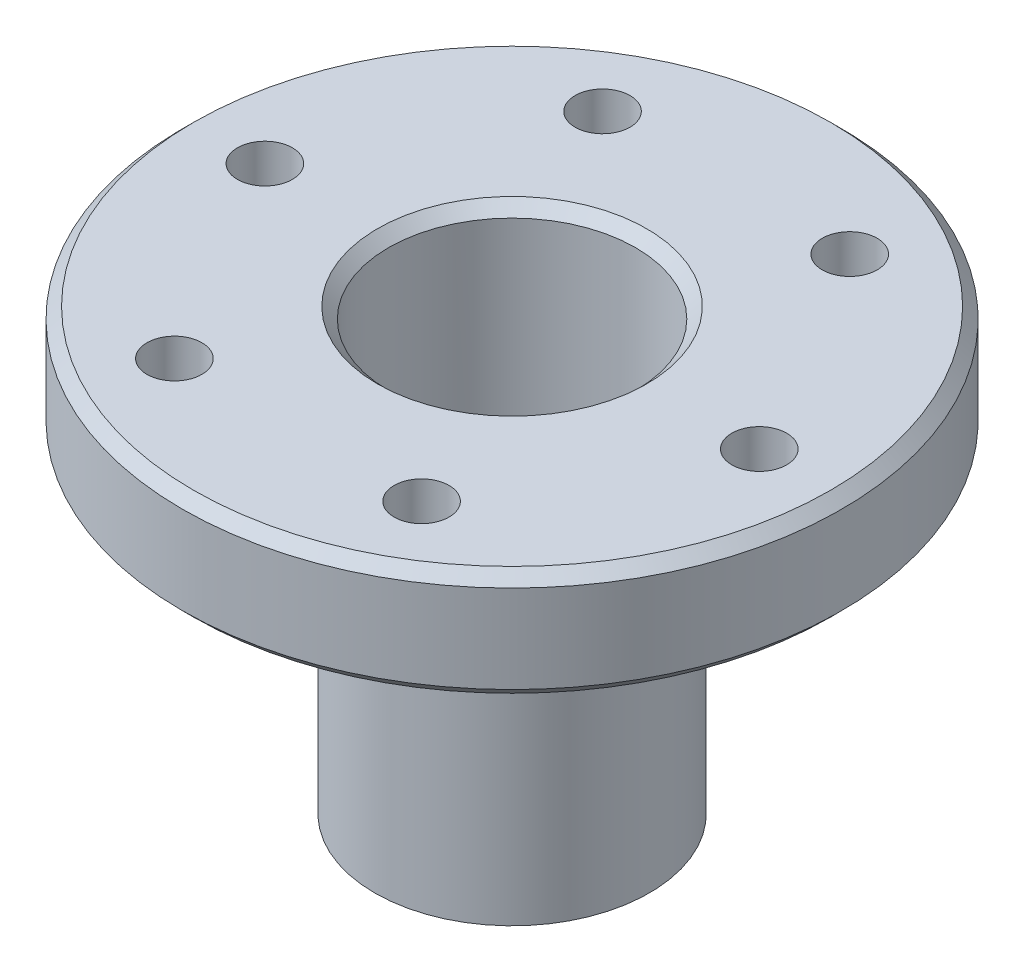
ISO-10303-21;
HEADER;
FILE_DESCRIPTION(('STEP AP214'),'2;1');
FILE_NAME('part.step','',(''),(''),'','','');
FILE_SCHEMA(('AUTOMOTIVE_DESIGN { 1 0 10303 214 1 1 1 1 }'));
ENDSEC;
DATA;
#1=APPLICATION_CONTEXT('core data for automotive mechanical design processes');
#2=APPLICATION_PROTOCOL_DEFINITION('international standard','automotive_design',2000,#1);
#3=PRODUCT_CONTEXT('',#1,'mechanical');
#4=PRODUCT('Part','Part','',(#3));
#5=PRODUCT_RELATED_PRODUCT_CATEGORY('part','',(#4));
#6=PRODUCT_DEFINITION_FORMATION('','',#4);
#7=PRODUCT_DEFINITION_CONTEXT('part definition',#1,'design');
#8=PRODUCT_DEFINITION('design','',#6,#7);
#9=PRODUCT_DEFINITION_SHAPE('','',#8);
#10=(LENGTH_UNIT() NAMED_UNIT(*) SI_UNIT(.MILLI.,.METRE.));
#11=(NAMED_UNIT(*) PLANE_ANGLE_UNIT() SI_UNIT($,.RADIAN.));
#12=(NAMED_UNIT(*) SI_UNIT($,.STERADIAN.) SOLID_ANGLE_UNIT());
#13=UNCERTAINTY_MEASURE_WITH_UNIT(LENGTH_MEASURE(1.E-05),#10,'distance_accuracy_value','');
#14=(GEOMETRIC_REPRESENTATION_CONTEXT(3) GLOBAL_UNCERTAINTY_ASSIGNED_CONTEXT((#13)) GLOBAL_UNIT_ASSIGNED_CONTEXT((#10,
#11,#12)) REPRESENTATION_CONTEXT('',''));
#15=CARTESIAN_POINT('',(0.,0.,0.));
#16=DIRECTION('',(0.,0.,1.));
#17=DIRECTION('',(1.,0.,0.));
#18=AXIS2_PLACEMENT_3D('',#15,#16,#17);
#19=CARTESIAN_POINT('',(0.,0.,0.));
#20=DIRECTION('',(0.,1.,0.));
#21=DIRECTION('',(0.,0.,1.));
#22=AXIS2_PLACEMENT_3D('',#19,#20,#21);
#23=PLANE('',#22);
#24=CARTESIAN_POINT('',(22.5000000000005,0.,-38.9711431702995));
#25=DIRECTION('',(0.,1.,0.));
#26=DIRECTION('',(0.,0.,1.));
#27=AXIS2_PLACEMENT_3D('',#24,#25,#26);
#28=CIRCLE('',#27,5.);
#29=CARTESIAN_POINT('',(22.5000000000005,0.,-33.9711431702995));
#30=VERTEX_POINT('',#29);
#31=EDGE_CURVE('E104',#30,#30,#28,.T.);
#32=ORIENTED_EDGE('',*,*,#31,.T.);
#33=EDGE_LOOP('',(#32));
#34=FACE_BOUND('',#33,.T.);
#35=CARTESIAN_POINT('',(-22.4999999999996,0.,-38.9711431702999));
#36=DIRECTION('',(0.,1.,0.));
#37=DIRECTION('',(0.,0.,1.));
#38=AXIS2_PLACEMENT_3D('',#35,#36,#37);
#39=CIRCLE('',#38,4.99999999999999);
#40=CARTESIAN_POINT('',(-22.4999999999996,0.,-33.9711431703));
#41=VERTEX_POINT('',#40);
#42=EDGE_CURVE('E98',#41,#41,#39,.T.);
#43=ORIENTED_EDGE('',*,*,#42,.T.);
#44=EDGE_LOOP('',(#43));
#45=FACE_BOUND('',#44,.T.);
#46=CARTESIAN_POINT('',(-45.,0.,-3.14233320495882E-13));
#47=DIRECTION('',(0.,1.,0.));
#48=DIRECTION('',(0.,0.,1.));
#49=AXIS2_PLACEMENT_3D('',#46,#47,#48);
#50=CIRCLE('',#49,4.99999999999999);
#51=CARTESIAN_POINT('',(-45.,0.,4.99999999999968));
#52=VERTEX_POINT('',#51);
#53=EDGE_CURVE('E92',#52,#52,#50,.T.);
#54=ORIENTED_EDGE('',*,*,#53,.T.);
#55=EDGE_LOOP('',(#54));
#56=FACE_BOUND('',#55,.T.);
#57=CARTESIAN_POINT('',(-22.5000000000002,0.,38.9711431702996));
#58=DIRECTION('',(0.,1.,0.));
#59=DIRECTION('',(0.,0.,1.));
#60=AXIS2_PLACEMENT_3D('',#57,#58,#59);
#61=CIRCLE('',#60,5.);
#62=CARTESIAN_POINT('',(-22.5000000000002,0.,43.9711431702996));
#63=VERTEX_POINT('',#62);
#64=EDGE_CURVE('E86',#63,#63,#61,.T.);
#65=ORIENTED_EDGE('',*,*,#64,.T.);
#66=EDGE_LOOP('',(#65));
#67=FACE_BOUND('',#66,.T.);
#68=CARTESIAN_POINT('',(22.4999999999999,0.,38.9711431702998));
#69=DIRECTION('',(0.,1.,0.));
#70=DIRECTION('',(0.,0.,1.));
#71=AXIS2_PLACEMENT_3D('',#68,#69,#70);
#72=CIRCLE('',#71,5.);
#73=CARTESIAN_POINT('',(22.4999999999999,0.,43.9711431702998));
#74=VERTEX_POINT('',#73);
#75=EDGE_CURVE('E80',#74,#74,#72,.T.);
#76=ORIENTED_EDGE('',*,*,#75,.T.);
#77=EDGE_LOOP('',(#76));
#78=FACE_BOUND('',#77,.T.);
#79=CARTESIAN_POINT('',(45.,0.,0.));
#80=DIRECTION('',(0.,1.,0.));
#81=DIRECTION('',(0.,0.,1.));
#82=AXIS2_PLACEMENT_3D('',#79,#80,#81);
#83=CIRCLE('',#82,5.);
#84=CARTESIAN_POINT('',(45.,0.,5.));
#85=VERTEX_POINT('',#84);
#86=EDGE_CURVE('E74',#85,#85,#83,.T.);
#87=ORIENTED_EDGE('',*,*,#86,.T.);
#88=EDGE_LOOP('',(#87));
#89=FACE_BOUND('',#88,.T.);
#90=CARTESIAN_POINT('',(0.,0.,0.));
#91=DIRECTION('',(0.,1.,0.));
#92=DIRECTION('',(0.,0.,1.));
#93=AXIS2_PLACEMENT_3D('',#90,#91,#92);
#94=CIRCLE('',#93,58.);
#95=CARTESIAN_POINT('',(0.,0.,58.));
#96=VERTEX_POINT('',#95);
#97=EDGE_CURVE('E64',#96,#96,#94,.F.);
#98=ORIENTED_EDGE('',*,*,#97,.T.);
#99=EDGE_LOOP('',(#98));
#100=FACE_BOUND('',#99,.T.);
#101=CARTESIAN_POINT('',(0.,0.,0.));
#102=DIRECTION('',(0.,1.,0.));
#103=DIRECTION('',(0.,0.,1.));
#104=AXIS2_PLACEMENT_3D('',#101,#102,#103);
#105=CIRCLE('',#104,25.);
#106=CARTESIAN_POINT('',(0.,0.,25.));
#107=VERTEX_POINT('',#106);
#108=EDGE_CURVE('E49',#107,#107,#105,.F.);
#109=ORIENTED_EDGE('',*,*,#108,.F.);
#110=EDGE_LOOP('',(#109));
#111=FACE_BOUND('',#110,.T.);
#112=ADVANCED_FACE('F37',(#34,#45,#56,#67,#78,#89,#100,#111),#23,.F.);
#113=CARTESIAN_POINT('',(0.,20.,0.));
#114=DIRECTION('',(0.,1.,0.));
#115=DIRECTION('',(0.,0.,1.));
#116=AXIS2_PLACEMENT_3D('',#113,#114,#115);
#117=PLANE('',#116);
#118=CARTESIAN_POINT('',(0.,20.,0.));
#119=DIRECTION('',(0.,1.,0.));
#120=DIRECTION('',(0.,0.,1.));
#121=AXIS2_PLACEMENT_3D('',#118,#119,#120);
#122=CIRCLE('',#121,24.5);
#123=CARTESIAN_POINT('',(0.,20.,24.5));
#124=VERTEX_POINT('',#123);
#125=EDGE_CURVE('E53',#124,#124,#122,.F.);
#126=ORIENTED_EDGE('',*,*,#125,.T.);
#127=EDGE_LOOP('',(#126));
#128=FACE_BOUND('',#127,.T.);
#129=CARTESIAN_POINT('',(0.,20.,0.));
#130=DIRECTION('',(0.,1.,0.));
#131=DIRECTION('',(0.,0.,1.));
#132=AXIS2_PLACEMENT_3D('',#129,#130,#131);
#133=CIRCLE('',#132,58.);
#134=CARTESIAN_POINT('',(0.,20.,58.));
#135=VERTEX_POINT('',#134);
#136=EDGE_CURVE('E58',#135,#135,#133,.T.);
#137=ORIENTED_EDGE('',*,*,#136,.T.);
#138=EDGE_LOOP('',(#137));
#139=FACE_BOUND('',#138,.T.);
#140=CARTESIAN_POINT('',(-22.4999999999996,20.,-38.9711431702999));
#141=DIRECTION('',(0.,1.,0.));
#142=DIRECTION('',(0.,0.,1.));
#143=AXIS2_PLACEMENT_3D('',#140,#141,#142);
#144=CIRCLE('',#143,4.99999999999999);
#145=CARTESIAN_POINT('',(-22.4999999999996,20.,-33.9711431703));
#146=VERTEX_POINT('',#145);
#147=EDGE_CURVE('E95',#146,#146,#144,.T.);
#148=ORIENTED_EDGE('',*,*,#147,.F.);
#149=EDGE_LOOP('',(#148));
#150=FACE_BOUND('',#149,.T.);
#151=CARTESIAN_POINT('',(-22.5000000000002,20.,38.9711431702996));
#152=DIRECTION('',(0.,1.,0.));
#153=DIRECTION('',(0.,0.,1.));
#154=AXIS2_PLACEMENT_3D('',#151,#152,#153);
#155=CIRCLE('',#154,5.);
#156=CARTESIAN_POINT('',(-22.5000000000002,20.,43.9711431702996));
#157=VERTEX_POINT('',#156);
#158=EDGE_CURVE('E83',#157,#157,#155,.T.);
#159=ORIENTED_EDGE('',*,*,#158,.F.);
#160=EDGE_LOOP('',(#159));
#161=FACE_BOUND('',#160,.T.);
#162=CARTESIAN_POINT('',(45.,20.,0.));
#163=DIRECTION('',(0.,1.,0.));
#164=DIRECTION('',(0.,0.,1.));
#165=AXIS2_PLACEMENT_3D('',#162,#163,#164);
#166=CIRCLE('',#165,5.);
#167=CARTESIAN_POINT('',(45.,20.,5.));
#168=VERTEX_POINT('',#167);
#169=EDGE_CURVE('E73',#168,#168,#166,.T.);
#170=ORIENTED_EDGE('',*,*,#169,.F.);
#171=EDGE_LOOP('',(#170));
#172=FACE_BOUND('',#171,.T.);
#173=CARTESIAN_POINT('',(22.4999999999999,20.,38.9711431702998));
#174=DIRECTION('',(0.,1.,0.));
#175=DIRECTION('',(0.,0.,1.));
#176=AXIS2_PLACEMENT_3D('',#173,#174,#175);
#177=CIRCLE('',#176,5.);
#178=CARTESIAN_POINT('',(22.4999999999999,20.,43.9711431702998));
#179=VERTEX_POINT('',#178);
#180=EDGE_CURVE('E77',#179,#179,#177,.T.);
#181=ORIENTED_EDGE('',*,*,#180,.F.);
#182=EDGE_LOOP('',(#181));
#183=FACE_BOUND('',#182,.T.);
#184=CARTESIAN_POINT('',(-45.,20.,-3.14233320495882E-13));
#185=DIRECTION('',(0.,1.,0.));
#186=DIRECTION('',(0.,0.,1.));
#187=AXIS2_PLACEMENT_3D('',#184,#185,#186);
#188=CIRCLE('',#187,4.99999999999999);
#189=CARTESIAN_POINT('',(-45.,20.,4.99999999999968));
#190=VERTEX_POINT('',#189);
#191=EDGE_CURVE('E89',#190,#190,#188,.T.);
#192=ORIENTED_EDGE('',*,*,#191,.F.);
#193=EDGE_LOOP('',(#192));
#194=FACE_BOUND('',#193,.T.);
#195=CARTESIAN_POINT('',(22.5000000000005,20.,-38.9711431702995));
#196=DIRECTION('',(0.,1.,0.));
#197=DIRECTION('',(0.,0.,1.));
#198=AXIS2_PLACEMENT_3D('',#195,#196,#197);
#199=CIRCLE('',#198,5.);
#200=CARTESIAN_POINT('',(22.5000000000005,20.,-33.9711431702995));
#201=VERTEX_POINT('',#200);
#202=EDGE_CURVE('E101',#201,#201,#199,.T.);
#203=ORIENTED_EDGE('',*,*,#202,.F.);
#204=EDGE_LOOP('',(#203));
#205=FACE_BOUND('',#204,.T.);
#206=ADVANCED_FACE('F122',(#128,#139,#150,#161,#172,#183,#194,#205),#117,.T.);
#207=CARTESIAN_POINT('',(0.,20.,0.));
#208=DIRECTION('',(0.,-1.,0.));
#209=DIRECTION('',(0.,0.,-1.));
#210=AXIS2_PLACEMENT_3D('',#207,#208,#209);
#211=CYLINDRICAL_SURFACE('',#210,60.);
#212=CARTESIAN_POINT('',(0.,1.99999999999999,0.));
#213=DIRECTION('',(0.,1.,0.));
#214=DIRECTION('',(0.,0.,1.));
#215=AXIS2_PLACEMENT_3D('',#212,#213,#214);
#216=CIRCLE('',#215,60.);
#217=CARTESIAN_POINT('',(0.,1.99999999999999,60.));
#218=VERTEX_POINT('',#217);
#219=EDGE_CURVE('E67',#218,#218,#216,.T.);
#220=ORIENTED_EDGE('',*,*,#219,.T.);
#221=EDGE_LOOP('',(#220));
#222=FACE_BOUND('',#221,.T.);
#223=CARTESIAN_POINT('',(0.,18.,0.));
#224=DIRECTION('',(0.,1.,0.));
#225=DIRECTION('',(0.,0.,1.));
#226=AXIS2_PLACEMENT_3D('',#223,#224,#225);
#227=CIRCLE('',#226,60.);
#228=CARTESIAN_POINT('',(0.,18.,60.));
#229=VERTEX_POINT('',#228);
#230=EDGE_CURVE('E70',#229,#229,#227,.F.);
#231=ORIENTED_EDGE('',*,*,#230,.T.);
#232=EDGE_LOOP('',(#231));
#233=FACE_BOUND('',#232,.T.);
#234=ADVANCED_FACE('F128',(#222,#233),#211,.T.);
#235=CARTESIAN_POINT('',(0.,20.,0.));
#236=DIRECTION('',(0.,-1.,0.));
#237=DIRECTION('',(0.,0.,-1.));
#238=AXIS2_PLACEMENT_3D('',#235,#236,#237);
#239=CYLINDRICAL_SURFACE('',#238,22.5);
#240=CARTESIAN_POINT('',(0.,-58.,0.));
#241=DIRECTION('',(0.,-1.,0.));
#242=DIRECTION('',(0.,0.,-1.));
#243=AXIS2_PLACEMENT_3D('',#240,#241,#242);
#244=CIRCLE('',#243,22.5);
#245=CARTESIAN_POINT('',(0.,-58.,-22.5));
#246=VERTEX_POINT('',#245);
#247=EDGE_CURVE('E45',#246,#246,#244,.T.);
#248=ORIENTED_EDGE('',*,*,#247,.T.);
#249=EDGE_LOOP('',(#248));
#250=FACE_BOUND('',#249,.T.);
#251=CARTESIAN_POINT('',(0.,18.,0.));
#252=DIRECTION('',(0.,1.,0.));
#253=DIRECTION('',(0.,0.,1.));
#254=AXIS2_PLACEMENT_3D('',#251,#252,#253);
#255=CIRCLE('',#254,22.5);
#256=CARTESIAN_POINT('',(0.,18.,22.5));
#257=VERTEX_POINT('',#256);
#258=EDGE_CURVE('E61',#257,#257,#255,.T.);
#259=ORIENTED_EDGE('',*,*,#258,.T.);
#260=EDGE_LOOP('',(#259));
#261=FACE_BOUND('',#260,.T.);
#262=ADVANCED_FACE('F136',(#250,#261),#239,.F.);
#263=CARTESIAN_POINT('',(45.,20.,0.));
#264=DIRECTION('',(0.,-1.,0.));
#265=DIRECTION('',(0.,0.,-1.));
#266=AXIS2_PLACEMENT_3D('',#263,#264,#265);
#267=CYLINDRICAL_SURFACE('',#266,5.);
#268=ORIENTED_EDGE('',*,*,#169,.T.);
#269=EDGE_LOOP('',(#268));
#270=FACE_BOUND('',#269,.T.);
#271=ORIENTED_EDGE('',*,*,#86,.F.);
#272=EDGE_LOOP('',(#271));
#273=FACE_BOUND('',#272,.T.);
#274=ADVANCED_FACE('F201',(#270,#273),#267,.F.);
#275=CARTESIAN_POINT('',(22.4999999999999,20.,38.9711431702998));
#276=DIRECTION('',(0.,-1.,0.));
#277=DIRECTION('',(0.,0.,-1.));
#278=AXIS2_PLACEMENT_3D('',#275,#276,#277);
#279=CYLINDRICAL_SURFACE('',#278,5.);
#280=ORIENTED_EDGE('',*,*,#180,.T.);
#281=EDGE_LOOP('',(#280));
#282=FACE_BOUND('',#281,.T.);
#283=ORIENTED_EDGE('',*,*,#75,.F.);
#284=EDGE_LOOP('',(#283));
#285=FACE_BOUND('',#284,.T.);
#286=ADVANCED_FACE('F197',(#282,#285),#279,.F.);
#287=CARTESIAN_POINT('',(-22.5000000000002,20.,38.9711431702996));
#288=DIRECTION('',(0.,-1.,0.));
#289=DIRECTION('',(0.,0.,-1.));
#290=AXIS2_PLACEMENT_3D('',#287,#288,#289);
#291=CYLINDRICAL_SURFACE('',#290,5.);
#292=ORIENTED_EDGE('',*,*,#158,.T.);
#293=EDGE_LOOP('',(#292));
#294=FACE_BOUND('',#293,.T.);
#295=ORIENTED_EDGE('',*,*,#64,.F.);
#296=EDGE_LOOP('',(#295));
#297=FACE_BOUND('',#296,.T.);
#298=ADVANCED_FACE('F193',(#294,#297),#291,.F.);
#299=CARTESIAN_POINT('',(-45.,20.,-3.14233320495882E-13));
#300=DIRECTION('',(0.,-1.,0.));
#301=DIRECTION('',(0.,0.,-1.));
#302=AXIS2_PLACEMENT_3D('',#299,#300,#301);
#303=CYLINDRICAL_SURFACE('',#302,4.99999999999999);
#304=ORIENTED_EDGE('',*,*,#191,.T.);
#305=EDGE_LOOP('',(#304));
#306=FACE_BOUND('',#305,.T.);
#307=ORIENTED_EDGE('',*,*,#53,.F.);
#308=EDGE_LOOP('',(#307));
#309=FACE_BOUND('',#308,.T.);
#310=ADVANCED_FACE('F187',(#306,#309),#303,.F.);
#311=CARTESIAN_POINT('',(-22.4999999999996,20.,-38.9711431702999));
#312=DIRECTION('',(0.,-1.,0.));
#313=DIRECTION('',(0.,0.,-1.));
#314=AXIS2_PLACEMENT_3D('',#311,#312,#313);
#315=CYLINDRICAL_SURFACE('',#314,4.99999999999999);
#316=ORIENTED_EDGE('',*,*,#147,.T.);
#317=EDGE_LOOP('',(#316));
#318=FACE_BOUND('',#317,.T.);
#319=ORIENTED_EDGE('',*,*,#42,.F.);
#320=EDGE_LOOP('',(#319));
#321=FACE_BOUND('',#320,.T.);
#322=ADVANCED_FACE('F181',(#318,#321),#315,.F.);
#323=CARTESIAN_POINT('',(22.5000000000005,20.,-38.9711431702995));
#324=DIRECTION('',(0.,-1.,0.));
#325=DIRECTION('',(0.,0.,-1.));
#326=AXIS2_PLACEMENT_3D('',#323,#324,#325);
#327=CYLINDRICAL_SURFACE('',#326,5.);
#328=ORIENTED_EDGE('',*,*,#202,.T.);
#329=EDGE_LOOP('',(#328));
#330=FACE_BOUND('',#329,.T.);
#331=ORIENTED_EDGE('',*,*,#31,.F.);
#332=EDGE_LOOP('',(#331));
#333=FACE_BOUND('',#332,.T.);
#334=ADVANCED_FACE('F146',(#330,#333),#327,.F.);
#335=CARTESIAN_POINT('',(0.,1.99999999999999,0.));
#336=DIRECTION('',(0.,1.,0.));
#337=DIRECTION('',(0.,0.,1.));
#338=AXIS2_PLACEMENT_3D('',#335,#336,#337);
#339=CONICAL_SURFACE('',#338,60.,0.785398163397448);
#340=ORIENTED_EDGE('',*,*,#97,.F.);
#341=EDGE_LOOP('',(#340));
#342=FACE_BOUND('',#341,.T.);
#343=ORIENTED_EDGE('',*,*,#219,.F.);
#344=EDGE_LOOP('',(#343));
#345=FACE_BOUND('',#344,.T.);
#346=ADVANCED_FACE('F139',(#342,#345),#339,.T.);
#347=CARTESIAN_POINT('',(0.,18.,0.));
#348=DIRECTION('',(0.,1.,0.));
#349=DIRECTION('',(0.,0.,1.));
#350=AXIS2_PLACEMENT_3D('',#347,#348,#349);
#351=CONICAL_SURFACE('',#350,22.5,0.785398163397452);
#352=ORIENTED_EDGE('',*,*,#125,.F.);
#353=EDGE_LOOP('',(#352));
#354=FACE_BOUND('',#353,.T.);
#355=ORIENTED_EDGE('',*,*,#258,.F.);
#356=EDGE_LOOP('',(#355));
#357=FACE_BOUND('',#356,.T.);
#358=ADVANCED_FACE('F145',(#354,#357),#351,.F.);
#359=CARTESIAN_POINT('',(0.,20.,0.));
#360=DIRECTION('',(0.,-1.,0.));
#361=DIRECTION('',(0.,0.,-1.));
#362=AXIS2_PLACEMENT_3D('',#359,#360,#361);
#363=CONICAL_SURFACE('',#362,58.,0.785398163397454);
#364=ORIENTED_EDGE('',*,*,#230,.F.);
#365=EDGE_LOOP('',(#364));
#366=FACE_BOUND('',#365,.T.);
#367=ORIENTED_EDGE('',*,*,#136,.F.);
#368=EDGE_LOOP('',(#367));
#369=FACE_BOUND('',#368,.T.);
#370=ADVANCED_FACE('F152',(#366,#369),#363,.T.);
#371=CARTESIAN_POINT('',(0.,-60.,0.));
#372=DIRECTION('',(0.,-1.,0.));
#373=DIRECTION('',(0.,0.,-1.));
#374=AXIS2_PLACEMENT_3D('',#371,#372,#373);
#375=PLANE('',#374);
#376=CARTESIAN_POINT('',(0.,-60.,0.));
#377=DIRECTION('',(0.,-1.,0.));
#378=DIRECTION('',(0.,0.,-1.));
#379=AXIS2_PLACEMENT_3D('',#376,#377,#378);
#380=CIRCLE('',#379,24.5);
#381=CARTESIAN_POINT('',(0.,-60.,-24.5));
#382=VERTEX_POINT('',#381);
#383=EDGE_CURVE('E10',#382,#382,#380,.F.);
#384=ORIENTED_EDGE('',*,*,#383,.T.);
#385=EDGE_LOOP('',(#384));
#386=FACE_BOUND('',#385,.T.);
#387=CARTESIAN_POINT('',(0.,-60.,0.));
#388=DIRECTION('',(0.,-1.,0.));
#389=DIRECTION('',(0.,0.,-1.));
#390=AXIS2_PLACEMENT_3D('',#387,#388,#389);
#391=CIRCLE('',#390,25.);
#392=CARTESIAN_POINT('',(0.,-60.,-25.));
#393=VERTEX_POINT('',#392);
#394=EDGE_CURVE('E107',#393,#393,#391,.T.);
#395=ORIENTED_EDGE('',*,*,#394,.T.);
#396=EDGE_LOOP('',(#395));
#397=FACE_BOUND('',#396,.T.);
#398=ADVANCED_FACE('F113',(#386,#397),#375,.T.);
#399=CARTESIAN_POINT('',(0.,-60.,0.));
#400=DIRECTION('',(0.,1.,0.));
#401=DIRECTION('',(0.,0.,1.));
#402=AXIS2_PLACEMENT_3D('',#399,#400,#401);
#403=CYLINDRICAL_SURFACE('',#402,25.);
#404=ORIENTED_EDGE('',*,*,#394,.F.);
#405=EDGE_LOOP('',(#404));
#406=FACE_BOUND('',#405,.T.);
#407=ORIENTED_EDGE('',*,*,#108,.T.);
#408=EDGE_LOOP('',(#407));
#409=FACE_BOUND('',#408,.T.);
#410=ADVANCED_FACE('F115',(#406,#409),#403,.T.);
#411=CARTESIAN_POINT('',(0.,-58.,0.));
#412=DIRECTION('',(0.,-1.,0.));
#413=DIRECTION('',(0.,0.,-1.));
#414=AXIS2_PLACEMENT_3D('',#411,#412,#413);
#415=CONICAL_SURFACE('',#414,22.5,0.785398163397455);
#416=ORIENTED_EDGE('',*,*,#383,.F.);
#417=EDGE_LOOP('',(#416));
#418=FACE_BOUND('',#417,.T.);
#419=ORIENTED_EDGE('',*,*,#247,.F.);
#420=EDGE_LOOP('',(#419));
#421=FACE_BOUND('',#420,.T.);
#422=ADVANCED_FACE('F40',(#418,#421),#415,.F.);
#423=CLOSED_SHELL('',(#112,#206,#234,#262,#274,#286,#298,#310,#322,#334,#346,#358,#370,#398,
#410,#422));
#424=MANIFOLD_SOLID_BREP('B2',#423);
#425=ADVANCED_BREP_SHAPE_REPRESENTATION('',(#18,#424),#14);
#426=SHAPE_DEFINITION_REPRESENTATION(#9,#425);
ENDSEC;
END-ISO-10303-21;
